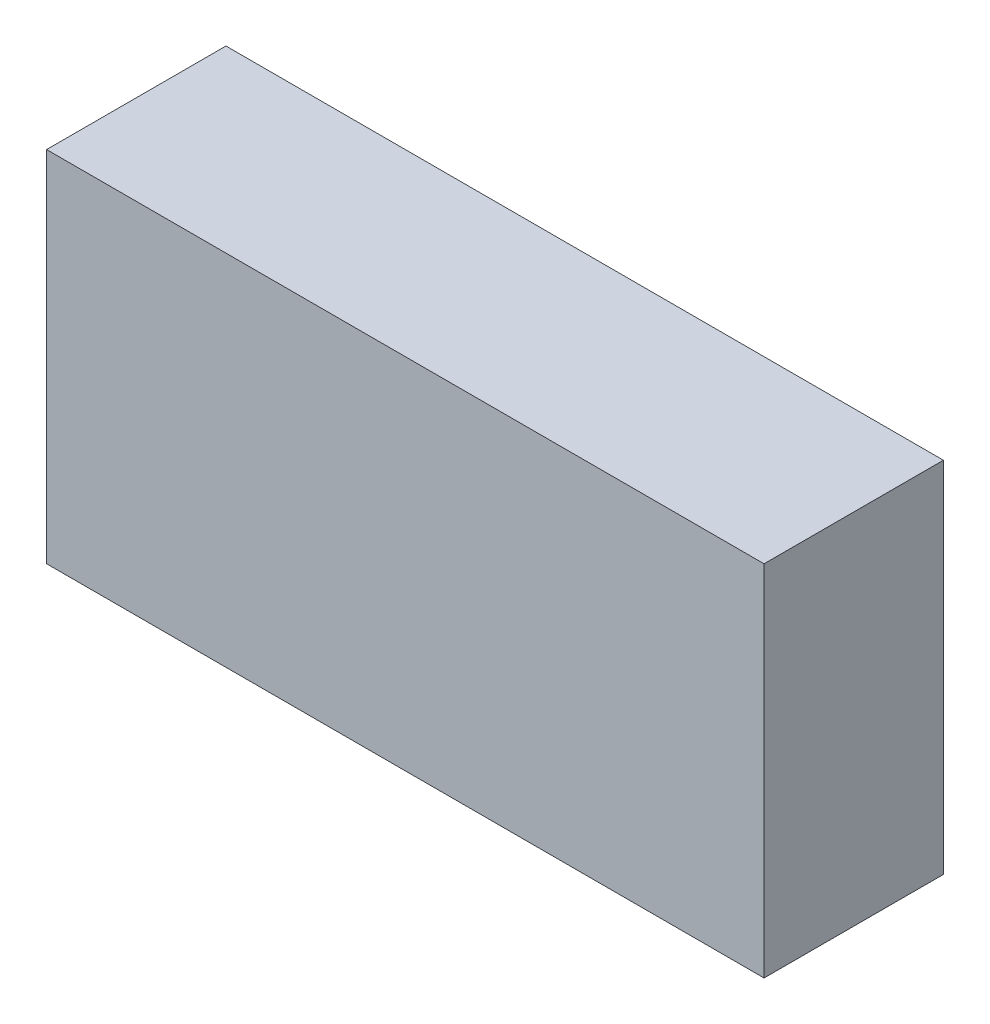
ISO-10303-21;
HEADER;
FILE_DESCRIPTION(('STEP AP214'),'2;1');
FILE_NAME('part.step','',(''),(''),'','','');
FILE_SCHEMA(('AUTOMOTIVE_DESIGN { 1 0 10303 214 1 1 1 1 }'));
ENDSEC;
DATA;
#1=APPLICATION_CONTEXT('core data for automotive mechanical design processes');
#2=APPLICATION_PROTOCOL_DEFINITION('international standard','automotive_design',2000,#1);
#3=PRODUCT_CONTEXT('',#1,'mechanical');
#4=PRODUCT('Part','Part','',(#3));
#5=PRODUCT_RELATED_PRODUCT_CATEGORY('part','',(#4));
#6=PRODUCT_DEFINITION_FORMATION('','',#4);
#7=PRODUCT_DEFINITION_CONTEXT('part definition',#1,'design');
#8=PRODUCT_DEFINITION('design','',#6,#7);
#9=PRODUCT_DEFINITION_SHAPE('','',#8);
#10=(LENGTH_UNIT() NAMED_UNIT(*) SI_UNIT(.MILLI.,.METRE.));
#11=(NAMED_UNIT(*) PLANE_ANGLE_UNIT() SI_UNIT($,.RADIAN.));
#12=(NAMED_UNIT(*) SI_UNIT($,.STERADIAN.) SOLID_ANGLE_UNIT());
#13=UNCERTAINTY_MEASURE_WITH_UNIT(LENGTH_MEASURE(1.E-05),#10,'distance_accuracy_value','');
#14=(GEOMETRIC_REPRESENTATION_CONTEXT(3) GLOBAL_UNCERTAINTY_ASSIGNED_CONTEXT((#13)) GLOBAL_UNIT_ASSIGNED_CONTEXT((#10,
#11,#12)) REPRESENTATION_CONTEXT('',''));
#15=CARTESIAN_POINT('',(0.,0.,0.));
#16=DIRECTION('',(0.,0.,1.));
#17=DIRECTION('',(1.,0.,0.));
#18=AXIS2_PLACEMENT_3D('',#15,#16,#17);
#19=CARTESIAN_POINT('',(0.,20.,5.));
#20=DIRECTION('',(1.,0.,0.));
#21=DIRECTION('',(0.,0.,-1.));
#22=AXIS2_PLACEMENT_3D('',#19,#20,#21);
#23=PLANE('',#22);
#24=DIRECTION('',(0.,-1.,0.));
#25=VECTOR('',#24,1.);
#26=CARTESIAN_POINT('',(0.,20.,-5.));
#27=LINE('',#26,#25);
#28=CARTESIAN_POINT('',(0.,20.,-5.));
#29=VERTEX_POINT('',#28);
#30=CARTESIAN_POINT('',(0.,0.,-5.));
#31=VERTEX_POINT('',#30);
#32=EDGE_CURVE('E104',#29,#31,#27,.T.);
#33=ORIENTED_EDGE('',*,*,#32,.T.);
#34=DIRECTION('',(0.,0.,-1.));
#35=VECTOR('',#34,1.);
#36=CARTESIAN_POINT('',(0.,0.,5.));
#37=LINE('',#36,#35);
#38=CARTESIAN_POINT('',(0.,0.,5.));
#39=VERTEX_POINT('',#38);
#40=EDGE_CURVE('E11',#39,#31,#37,.T.);
#41=ORIENTED_EDGE('',*,*,#40,.F.);
#42=DIRECTION('',(0.,-1.,0.));
#43=VECTOR('',#42,1.);
#44=CARTESIAN_POINT('',(0.,20.,5.));
#45=LINE('',#44,#43);
#46=CARTESIAN_POINT('',(0.,20.,5.));
#47=VERTEX_POINT('',#46);
#48=EDGE_CURVE('E92',#47,#39,#45,.T.);
#49=ORIENTED_EDGE('',*,*,#48,.F.);
#50=DIRECTION('',(0.,0.,-1.));
#51=VECTOR('',#50,1.);
#52=CARTESIAN_POINT('',(0.,20.,5.));
#53=LINE('',#52,#51);
#54=EDGE_CURVE('E100',#47,#29,#53,.T.);
#55=ORIENTED_EDGE('',*,*,#54,.T.);
#56=EDGE_LOOP('',(#33,#41,#49,#55));
#57=FACE_BOUND('',#56,.T.);
#58=ADVANCED_FACE('F41',(#57),#23,.F.);
#59=CARTESIAN_POINT('',(0.,0.,5.));
#60=DIRECTION('',(0.,1.,0.));
#61=DIRECTION('',(0.,0.,1.));
#62=AXIS2_PLACEMENT_3D('',#59,#60,#61);
#63=PLANE('',#62);
#64=DIRECTION('',(1.,0.,0.));
#65=VECTOR('',#64,1.);
#66=CARTESIAN_POINT('',(0.,0.,-5.));
#67=LINE('',#66,#65);
#68=CARTESIAN_POINT('',(40.,0.,-5.));
#69=VERTEX_POINT('',#68);
#70=EDGE_CURVE('E96',#31,#69,#67,.T.);
#71=ORIENTED_EDGE('',*,*,#70,.T.);
#72=DIRECTION('',(0.,0.,-1.));
#73=VECTOR('',#72,1.);
#74=CARTESIAN_POINT('',(40.,0.,5.));
#75=LINE('',#74,#73);
#76=CARTESIAN_POINT('',(40.,0.,5.));
#77=VERTEX_POINT('',#76);
#78=EDGE_CURVE('E49',#77,#69,#75,.T.);
#79=ORIENTED_EDGE('',*,*,#78,.F.);
#80=DIRECTION('',(1.,0.,0.));
#81=VECTOR('',#80,1.);
#82=CARTESIAN_POINT('',(0.,0.,5.));
#83=LINE('',#82,#81);
#84=EDGE_CURVE('E87',#39,#77,#83,.T.);
#85=ORIENTED_EDGE('',*,*,#84,.F.);
#86=ORIENTED_EDGE('',*,*,#40,.T.);
#87=EDGE_LOOP('',(#71,#79,#85,#86));
#88=FACE_BOUND('',#87,.T.);
#89=ADVANCED_FACE('F95',(#88),#63,.F.);
#90=CARTESIAN_POINT('',(40.,0.,5.));
#91=DIRECTION('',(-1.,0.,0.));
#92=DIRECTION('',(0.,0.,1.));
#93=AXIS2_PLACEMENT_3D('',#90,#91,#92);
#94=PLANE('',#93);
#95=DIRECTION('',(0.,1.,0.));
#96=VECTOR('',#95,1.);
#97=CARTESIAN_POINT('',(40.,0.,-5.));
#98=LINE('',#97,#96);
#99=CARTESIAN_POINT('',(40.,20.,-5.));
#100=VERTEX_POINT('',#99);
#101=EDGE_CURVE('E74',#69,#100,#98,.T.);
#102=ORIENTED_EDGE('',*,*,#101,.T.);
#103=DIRECTION('',(0.,0.,-1.));
#104=VECTOR('',#103,1.);
#105=CARTESIAN_POINT('',(40.,20.,5.));
#106=LINE('',#105,#104);
#107=CARTESIAN_POINT('',(40.,20.,5.));
#108=VERTEX_POINT('',#107);
#109=EDGE_CURVE('E97',#108,#100,#106,.T.);
#110=ORIENTED_EDGE('',*,*,#109,.F.);
#111=DIRECTION('',(0.,1.,0.));
#112=VECTOR('',#111,1.);
#113=CARTESIAN_POINT('',(40.,0.,5.));
#114=LINE('',#113,#112);
#115=EDGE_CURVE('E90',#77,#108,#114,.T.);
#116=ORIENTED_EDGE('',*,*,#115,.F.);
#117=ORIENTED_EDGE('',*,*,#78,.T.);
#118=EDGE_LOOP('',(#102,#110,#116,#117));
#119=FACE_BOUND('',#118,.T.);
#120=ADVANCED_FACE('F98',(#119),#94,.F.);
#121=CARTESIAN_POINT('',(40.,20.,5.));
#122=DIRECTION('',(0.,-1.,0.));
#123=DIRECTION('',(0.,0.,-1.));
#124=AXIS2_PLACEMENT_3D('',#121,#122,#123);
#125=PLANE('',#124);
#126=DIRECTION('',(-1.,0.,0.));
#127=VECTOR('',#126,1.);
#128=CARTESIAN_POINT('',(40.,20.,-5.));
#129=LINE('',#128,#127);
#130=EDGE_CURVE('E80',#100,#29,#129,.T.);
#131=ORIENTED_EDGE('',*,*,#130,.T.);
#132=ORIENTED_EDGE('',*,*,#54,.F.);
#133=DIRECTION('',(-1.,0.,0.));
#134=VECTOR('',#133,1.);
#135=CARTESIAN_POINT('',(40.,20.,5.));
#136=LINE('',#135,#134);
#137=EDGE_CURVE('E57',#108,#47,#136,.T.);
#138=ORIENTED_EDGE('',*,*,#137,.F.);
#139=ORIENTED_EDGE('',*,*,#109,.T.);
#140=EDGE_LOOP('',(#131,#132,#138,#139));
#141=FACE_BOUND('',#140,.T.);
#142=ADVANCED_FACE('F111',(#141),#125,.F.);
#143=CARTESIAN_POINT('',(0.,0.,5.));
#144=DIRECTION('',(0.,0.,1.));
#145=DIRECTION('',(1.,0.,0.));
#146=AXIS2_PLACEMENT_3D('',#143,#144,#145);
#147=PLANE('',#146);
#148=ORIENTED_EDGE('',*,*,#48,.T.);
#149=ORIENTED_EDGE('',*,*,#84,.T.);
#150=ORIENTED_EDGE('',*,*,#115,.T.);
#151=ORIENTED_EDGE('',*,*,#137,.T.);
#152=EDGE_LOOP('',(#148,#149,#150,#151));
#153=FACE_BOUND('',#152,.T.);
#154=ADVANCED_FACE('F88',(#153),#147,.T.);
#155=CARTESIAN_POINT('',(0.,0.,-5.));
#156=DIRECTION('',(0.,0.,1.));
#157=DIRECTION('',(1.,0.,0.));
#158=AXIS2_PLACEMENT_3D('',#155,#156,#157);
#159=PLANE('',#158);
#160=ORIENTED_EDGE('',*,*,#32,.F.);
#161=ORIENTED_EDGE('',*,*,#130,.F.);
#162=ORIENTED_EDGE('',*,*,#101,.F.);
#163=ORIENTED_EDGE('',*,*,#70,.F.);
#164=EDGE_LOOP('',(#160,#161,#162,#163));
#165=FACE_BOUND('',#164,.T.);
#166=ADVANCED_FACE('F114',(#165),#159,.F.);
#167=CLOSED_SHELL('',(#58,#89,#120,#142,#154,#166));
#168=MANIFOLD_SOLID_BREP('B2',#167);
#169=ADVANCED_BREP_SHAPE_REPRESENTATION('',(#18,#168),#14);
#170=SHAPE_DEFINITION_REPRESENTATION(#9,#169);
ENDSEC;
END-ISO-10303-21;
